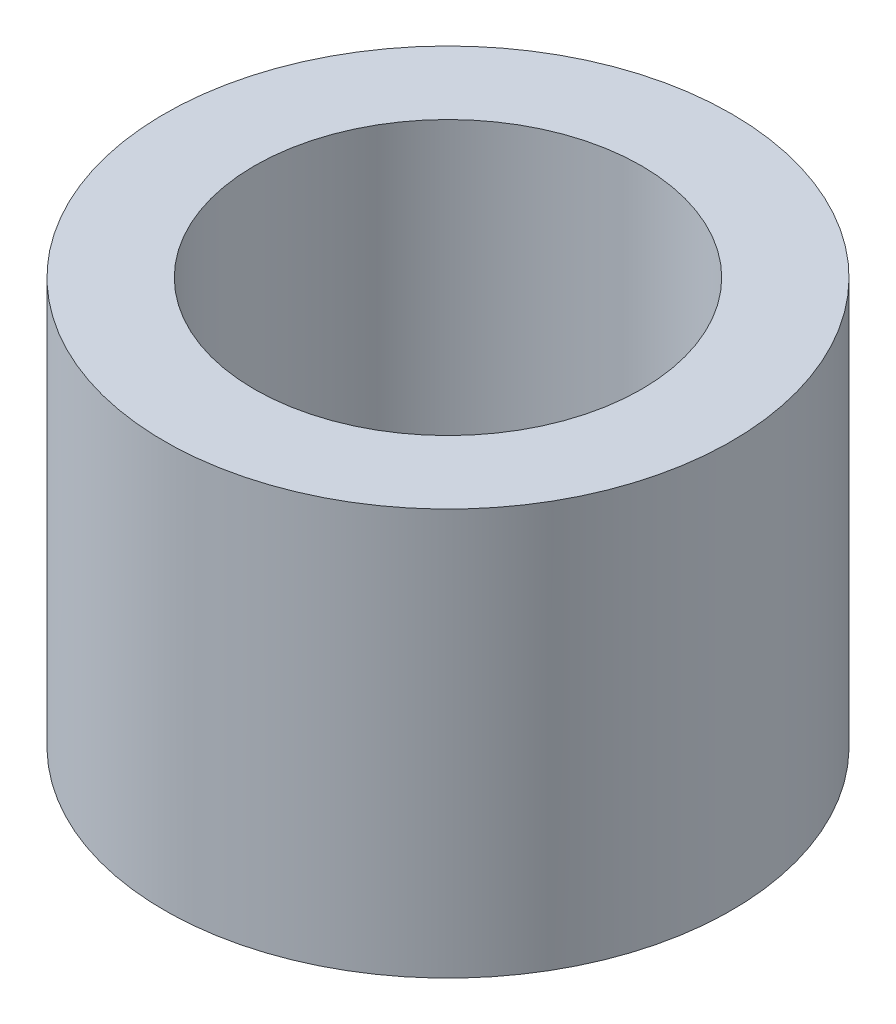
ISO-10303-21;
HEADER;
FILE_DESCRIPTION(('STEP AP214'),'2;1');
FILE_NAME('part.step','',(''),(''),'','','');
FILE_SCHEMA(('AUTOMOTIVE_DESIGN { 1 0 10303 214 1 1 1 1 }'));
ENDSEC;
DATA;
#1=APPLICATION_CONTEXT('core data for automotive mechanical design processes');
#2=APPLICATION_PROTOCOL_DEFINITION('international standard','automotive_design',2000,#1);
#3=PRODUCT_CONTEXT('',#1,'mechanical');
#4=PRODUCT('Part','Part','',(#3));
#5=PRODUCT_RELATED_PRODUCT_CATEGORY('part','',(#4));
#6=PRODUCT_DEFINITION_FORMATION('','',#4);
#7=PRODUCT_DEFINITION_CONTEXT('part definition',#1,'design');
#8=PRODUCT_DEFINITION('design','',#6,#7);
#9=PRODUCT_DEFINITION_SHAPE('','',#8);
#10=(LENGTH_UNIT() NAMED_UNIT(*) SI_UNIT(.MILLI.,.METRE.));
#11=(NAMED_UNIT(*) PLANE_ANGLE_UNIT() SI_UNIT($,.RADIAN.));
#12=(NAMED_UNIT(*) SI_UNIT($,.STERADIAN.) SOLID_ANGLE_UNIT());
#13=UNCERTAINTY_MEASURE_WITH_UNIT(LENGTH_MEASURE(1.E-05),#10,'distance_accuracy_value','');
#14=(GEOMETRIC_REPRESENTATION_CONTEXT(3) GLOBAL_UNCERTAINTY_ASSIGNED_CONTEXT((#13)) GLOBAL_UNIT_ASSIGNED_CONTEXT((#10,
#11,#12)) REPRESENTATION_CONTEXT('',''));
#15=CARTESIAN_POINT('',(0.,0.,0.));
#16=DIRECTION('',(0.,0.,1.));
#17=DIRECTION('',(1.,0.,0.));
#18=AXIS2_PLACEMENT_3D('',#15,#16,#17);
#19=CARTESIAN_POINT('',(0.,11.461,0.));
#20=DIRECTION('',(0.,-1.,0.));
#21=DIRECTION('',(0.,0.,-1.));
#22=AXIS2_PLACEMENT_3D('',#19,#20,#21);
#23=CYLINDRICAL_SURFACE('',#22,8.001);
#24=CARTESIAN_POINT('',(0.,11.461,0.));
#25=DIRECTION('',(0.,1.,0.));
#26=DIRECTION('',(0.,0.,1.));
#27=AXIS2_PLACEMENT_3D('',#24,#25,#26);
#28=CIRCLE('',#27,8.001);
#29=CARTESIAN_POINT('',(0.,11.461,-8.001));
#30=VERTEX_POINT('',#29);
#31=EDGE_CURVE('E11',#30,#30,#28,.T.);
#32=CARTESIAN_POINT('',(0.,0.,0.));
#33=DIRECTION('',(0.,1.,0.));
#34=DIRECTION('',(-1.,0.,0.));
#35=AXIS2_PLACEMENT_3D('',#32,#33,#34);
#36=CIRCLE('',#35,8.001);
#37=CARTESIAN_POINT('',(0.,0.,-8.001));
#38=VERTEX_POINT('',#37);
#39=EDGE_CURVE('E43',#38,#38,#36,.T.);
#40=CARTESIAN_POINT('',(0.,11.461,-8.001));
#41=CARTESIAN_POINT('',(0.,11.3416145833333,-8.001));
#42=CARTESIAN_POINT('',(0.,11.2222291666667,-8.001));
#43=CARTESIAN_POINT('',(0.,10.9834583333333,-8.001));
#44=CARTESIAN_POINT('',(0.,10.8640729166667,-8.001));
#45=CARTESIAN_POINT('',(0.,10.6253020833333,-8.001));
#46=CARTESIAN_POINT('',(0.,10.5059166666667,-8.001));
#47=CARTESIAN_POINT('',(0.,10.2671458333333,-8.001));
#48=CARTESIAN_POINT('',(0.,10.1477604166667,-8.001));
#49=CARTESIAN_POINT('',(0.,9.90898958333334,-8.001));
#50=CARTESIAN_POINT('',(0.,9.78960416666667,-8.001));
#51=CARTESIAN_POINT('',(0.,9.55083333333334,-8.001));
#52=CARTESIAN_POINT('',(0.,9.43144791666667,-8.001));
#53=CARTESIAN_POINT('',(0.,9.19267708333333,-8.001));
#54=CARTESIAN_POINT('',(0.,9.07329166666667,-8.001));
#55=CARTESIAN_POINT('',(0.,8.83452083333333,-8.001));
#56=CARTESIAN_POINT('',(0.,8.71513541666667,-8.001));
#57=CARTESIAN_POINT('',(0.,8.47636458333334,-8.001));
#58=CARTESIAN_POINT('',(0.,8.35697916666667,-8.001));
#59=CARTESIAN_POINT('',(0.,8.11820833333334,-8.001));
#60=CARTESIAN_POINT('',(0.,7.99882291666667,-8.001));
#61=CARTESIAN_POINT('',(0.,7.76005208333334,-8.001));
#62=CARTESIAN_POINT('',(0.,7.64066666666667,-8.001));
#63=CARTESIAN_POINT('',(0.,7.40189583333334,-8.001));
#64=CARTESIAN_POINT('',(0.,7.28251041666667,-8.001));
#65=CARTESIAN_POINT('',(0.,7.04373958333334,-8.001));
#66=CARTESIAN_POINT('',(0.,6.92435416666667,-8.001));
#67=CARTESIAN_POINT('',(0.,6.68558333333334,-8.001));
#68=CARTESIAN_POINT('',(0.,6.56619791666667,-8.001));
#69=CARTESIAN_POINT('',(0.,6.32742708333334,-8.001));
#70=CARTESIAN_POINT('',(0.,6.20804166666667,-8.001));
#71=CARTESIAN_POINT('',(0.,5.96927083333334,-8.001));
#72=CARTESIAN_POINT('',(0.,5.84988541666667,-8.001));
#73=CARTESIAN_POINT('',(0.,5.61111458333334,-8.001));
#74=CARTESIAN_POINT('',(0.,5.49172916666667,-8.001));
#75=CARTESIAN_POINT('',(0.,5.25295833333334,-8.001));
#76=CARTESIAN_POINT('',(0.,5.13357291666667,-8.001));
#77=CARTESIAN_POINT('',(0.,4.89480208333334,-8.001));
#78=CARTESIAN_POINT('',(0.,4.77541666666667,-8.001));
#79=CARTESIAN_POINT('',(0.,4.53664583333334,-8.001));
#80=CARTESIAN_POINT('',(0.,4.41726041666667,-8.001));
#81=CARTESIAN_POINT('',(0.,4.17848958333334,-8.001));
#82=CARTESIAN_POINT('',(0.,4.05910416666667,-8.001));
#83=CARTESIAN_POINT('',(0.,3.82033333333334,-8.001));
#84=CARTESIAN_POINT('',(0.,3.70094791666667,-8.001));
#85=CARTESIAN_POINT('',(0.,3.46217708333334,-8.001));
#86=CARTESIAN_POINT('',(0.,3.34279166666667,-8.001));
#87=CARTESIAN_POINT('',(0.,3.10402083333334,-8.001));
#88=CARTESIAN_POINT('',(0.,2.98463541666667,-8.001));
#89=CARTESIAN_POINT('',(0.,2.74586458333334,-8.001));
#90=CARTESIAN_POINT('',(0.,2.62647916666667,-8.001));
#91=CARTESIAN_POINT('',(0.,2.38770833333334,-8.001));
#92=CARTESIAN_POINT('',(0.,2.26832291666667,-8.001));
#93=CARTESIAN_POINT('',(0.,2.02955208333334,-8.001));
#94=CARTESIAN_POINT('',(0.,1.91016666666667,-8.001));
#95=CARTESIAN_POINT('',(0.,1.67139583333334,-8.001));
#96=CARTESIAN_POINT('',(0.,1.55201041666667,-8.001));
#97=CARTESIAN_POINT('',(0.,1.31323958333334,-8.001));
#98=CARTESIAN_POINT('',(0.,1.19385416666667,-8.001));
#99=CARTESIAN_POINT('',(0.,0.95508333333334,-8.001));
#100=CARTESIAN_POINT('',(0.,0.835697916666673,-8.001));
#101=CARTESIAN_POINT('',(0.,0.59692708333334,-8.001));
#102=CARTESIAN_POINT('',(0.,0.477541666666674,-8.001));
#103=CARTESIAN_POINT('',(0.,0.23877083333334,-8.001));
#104=CARTESIAN_POINT('',(0.,0.119385416666674,-8.001));
#105=CARTESIAN_POINT('',(0.,0.,-8.001));
#106=B_SPLINE_CURVE_WITH_KNOTS('',3,(#40,#41,#42,#43,#44,#45,#46,#47,#48,#49,#50,#51,#52,#53,
#54,#55,#56,#57,#58,#59,#60,#61,#62,#63,#64,#65,#66,#67,#68,#69,#70,#71,#72,#73,#74,#75,#76,#77,
#78,#79,#80,#81,#82,#83,#84,#85,#86,#87,#88,#89,#90,#91,#92,#93,#94,#95,#96,#97,#98,#99,#100,
#101,#102,#103,#104,#105),.UNSPECIFIED.,.F.,.F.,(4,2,2,2,2,2,2,2,2,2,2,2,2,2,2,2,2,2,2,2,2,2,2,
2,2,2,2,2,2,2,2,2,4),(0.,0.358156249999998,0.716312499999998,1.07446875,1.432625,1.79078125,
2.1489375,2.50709375,2.86525,3.22340625,3.5815625,3.93971875,4.297875,4.65603125,
5.01418749999999,5.37234375,5.73049999999999,6.08865625,6.44681249999999,6.80496874999999,
7.16312499999999,7.52128124999999,7.87943749999999,8.23759374999999,8.59574999999999,
8.95390624999999,9.31206249999999,9.67021874999999,10.028375,10.38653125,10.7446875,11.10284375,
11.461),.UNSPECIFIED.);
#107=EDGE_CURVE('BSEAM37',#30,#38,#106,.T.);
#108=ORIENTED_EDGE('',*,*,#31,.F.);
#109=ORIENTED_EDGE('',*,*,#39,.T.);
#110=ORIENTED_EDGE('',*,*,#107,.T.);
#111=ORIENTED_EDGE('',*,*,#107,.F.);
#112=EDGE_LOOP('',(#108,#110,#109,#111));
#113=FACE_BOUND('',#112,.T.);
#114=ADVANCED_FACE('F37',(#113),#23,.T.);
#115=CARTESIAN_POINT('',(0.,11.461,0.));
#116=DIRECTION('',(0.,1.,0.));
#117=DIRECTION('',(0.,0.,1.));
#118=AXIS2_PLACEMENT_3D('',#115,#116,#117);
#119=PLANE('',#118);
#120=CARTESIAN_POINT('',(0.,11.461,0.));
#121=DIRECTION('',(0.,1.,0.));
#122=DIRECTION('',(0.,0.,1.));
#123=AXIS2_PLACEMENT_3D('',#120,#121,#122);
#124=CIRCLE('',#123,5.461);
#125=CARTESIAN_POINT('',(0.,11.461,5.461));
#126=VERTEX_POINT('',#125);
#127=EDGE_CURVE('E70',#126,#126,#124,.T.);
#128=ORIENTED_EDGE('',*,*,#127,.F.);
#129=EDGE_LOOP('',(#128));
#130=FACE_BOUND('',#129,.T.);
#131=ORIENTED_EDGE('',*,*,#31,.T.);
#132=EDGE_LOOP('',(#131));
#133=FACE_BOUND('',#132,.T.);
#134=ADVANCED_FACE('F49',(#130,#133),#119,.T.);
#135=CARTESIAN_POINT('',(0.,-2.54,0.));
#136=DIRECTION('',(0.,1.,0.));
#137=DIRECTION('',(-1.,0.,0.));
#138=AXIS2_PLACEMENT_3D('',#135,#136,#137);
#139=CONICAL_SURFACE('',#138,0.,1.26339885367207);
#140=ORIENTED_EDGE('',*,*,#39,.F.);
#141=EDGE_LOOP('',(#140));
#142=FACE_BOUND('',#141,.T.);
#143=CARTESIAN_POINT('',(0.,-2.54,0.));
#144=VERTEX_POINT('',#143);
#145=VERTEX_LOOP('',#144);
#146=FACE_BOUND('',#145,.T.);
#147=ADVANCED_FACE('F46',(#142,#146),#139,.T.);
#148=CARTESIAN_POINT('',(0.,2.001,0.));
#149=DIRECTION('',(0.,1.,0.));
#150=DIRECTION('',(0.,0.,1.));
#151=AXIS2_PLACEMENT_3D('',#148,#149,#150);
#152=CYLINDRICAL_SURFACE('',#151,5.461);
#153=CARTESIAN_POINT('',(0.,2.001,0.));
#154=DIRECTION('',(0.,1.,0.));
#155=DIRECTION('',(0.,0.,1.));
#156=AXIS2_PLACEMENT_3D('',#153,#154,#155);
#157=CIRCLE('',#156,5.461);
#158=CARTESIAN_POINT('',(0.,2.001,5.461));
#159=VERTEX_POINT('',#158);
#160=EDGE_CURVE('E68',#159,#159,#157,.T.);
#161=CARTESIAN_POINT('',(0.,2.001,5.461));
#162=CARTESIAN_POINT('',(0.,2.09954166666667,5.461));
#163=CARTESIAN_POINT('',(0.,2.19808333333333,5.461));
#164=CARTESIAN_POINT('',(0.,2.39516666666667,5.461));
#165=CARTESIAN_POINT('',(0.,2.49370833333333,5.461));
#166=CARTESIAN_POINT('',(0.,2.69079166666667,5.461));
#167=CARTESIAN_POINT('',(0.,2.78933333333333,5.461));
#168=CARTESIAN_POINT('',(0.,2.98641666666667,5.461));
#169=CARTESIAN_POINT('',(0.,3.08495833333333,5.461));
#170=CARTESIAN_POINT('',(0.,3.28204166666667,5.461));
#171=CARTESIAN_POINT('',(0.,3.38058333333333,5.461));
#172=CARTESIAN_POINT('',(0.,3.57766666666667,5.461));
#173=CARTESIAN_POINT('',(0.,3.67620833333333,5.461));
#174=CARTESIAN_POINT('',(0.,3.87329166666667,5.461));
#175=CARTESIAN_POINT('',(0.,3.97183333333333,5.461));
#176=CARTESIAN_POINT('',(0.,4.16891666666667,5.461));
#177=CARTESIAN_POINT('',(0.,4.26745833333333,5.461));
#178=CARTESIAN_POINT('',(0.,4.46454166666667,5.461));
#179=CARTESIAN_POINT('',(0.,4.56308333333333,5.461));
#180=CARTESIAN_POINT('',(0.,4.76016666666667,5.461));
#181=CARTESIAN_POINT('',(0.,4.85870833333333,5.461));
#182=CARTESIAN_POINT('',(0.,5.05579166666667,5.461));
#183=CARTESIAN_POINT('',(0.,5.15433333333333,5.461));
#184=CARTESIAN_POINT('',(0.,5.35141666666667,5.461));
#185=CARTESIAN_POINT('',(0.,5.44995833333333,5.461));
#186=CARTESIAN_POINT('',(0.,5.64704166666667,5.461));
#187=CARTESIAN_POINT('',(0.,5.74558333333333,5.461));
#188=CARTESIAN_POINT('',(0.,5.94266666666667,5.461));
#189=CARTESIAN_POINT('',(0.,6.04120833333333,5.461));
#190=CARTESIAN_POINT('',(0.,6.23829166666667,5.461));
#191=CARTESIAN_POINT('',(0.,6.33683333333333,5.461));
#192=CARTESIAN_POINT('',(0.,6.53391666666667,5.461));
#193=CARTESIAN_POINT('',(0.,6.63245833333333,5.461));
#194=CARTESIAN_POINT('',(0.,6.82954166666667,5.461));
#195=CARTESIAN_POINT('',(0.,6.92808333333333,5.461));
#196=CARTESIAN_POINT('',(0.,7.12516666666667,5.461));
#197=CARTESIAN_POINT('',(0.,7.22370833333333,5.461));
#198=CARTESIAN_POINT('',(0.,7.42079166666667,5.461));
#199=CARTESIAN_POINT('',(0.,7.51933333333333,5.461));
#200=CARTESIAN_POINT('',(0.,7.71641666666667,5.461));
#201=CARTESIAN_POINT('',(0.,7.81495833333333,5.461));
#202=CARTESIAN_POINT('',(0.,8.01204166666667,5.461));
#203=CARTESIAN_POINT('',(0.,8.11058333333333,5.461));
#204=CARTESIAN_POINT('',(0.,8.30766666666667,5.461));
#205=CARTESIAN_POINT('',(0.,8.40620833333334,5.461));
#206=CARTESIAN_POINT('',(0.,8.60329166666667,5.461));
#207=CARTESIAN_POINT('',(0.,8.70183333333333,5.461));
#208=CARTESIAN_POINT('',(0.,8.89891666666667,5.461));
#209=CARTESIAN_POINT('',(0.,8.99745833333333,5.461));
#210=CARTESIAN_POINT('',(0.,9.19454166666667,5.461));
#211=CARTESIAN_POINT('',(0.,9.29308333333333,5.461));
#212=CARTESIAN_POINT('',(0.,9.49016666666667,5.461));
#213=CARTESIAN_POINT('',(0.,9.58870833333333,5.461));
#214=CARTESIAN_POINT('',(0.,9.78579166666667,5.461));
#215=CARTESIAN_POINT('',(0.,9.88433333333333,5.461));
#216=CARTESIAN_POINT('',(0.,10.0814166666667,5.461));
#217=CARTESIAN_POINT('',(0.,10.1799583333333,5.461));
#218=CARTESIAN_POINT('',(0.,10.3770416666667,5.461));
#219=CARTESIAN_POINT('',(0.,10.4755833333333,5.461));
#220=CARTESIAN_POINT('',(0.,10.6726666666667,5.461));
#221=CARTESIAN_POINT('',(0.,10.7712083333333,5.461));
#222=CARTESIAN_POINT('',(0.,10.9682916666667,5.461));
#223=CARTESIAN_POINT('',(0.,11.0668333333333,5.461));
#224=CARTESIAN_POINT('',(0.,11.2639166666667,5.461));
#225=CARTESIAN_POINT('',(0.,11.3624583333333,5.461));
#226=CARTESIAN_POINT('',(0.,11.461,5.461));
#227=B_SPLINE_CURVE_WITH_KNOTS('',3,(#161,#162,#163,#164,#165,#166,#167,#168,#169,#170,#171,
#172,#173,#174,#175,#176,#177,#178,#179,#180,#181,#182,#183,#184,#185,#186,#187,#188,#189,#190,
#191,#192,#193,#194,#195,#196,#197,#198,#199,#200,#201,#202,#203,#204,#205,#206,#207,#208,#209,
#210,#211,#212,#213,#214,#215,#216,#217,#218,#219,#220,#221,#222,#223,#224,#225,#226),
.UNSPECIFIED.,.F.,.F.,(4,2,2,2,2,2,2,2,2,2,2,2,2,2,2,2,2,2,2,2,2,2,2,2,2,2,2,2,2,2,2,2,4),(0.,
0.295625,0.59125,0.886875,1.1825,1.478125,1.77375,2.069375,2.365,2.660625,2.95625,3.251875,
3.5475,3.843125,4.13875,4.434375,4.73,5.025625,5.32125,5.616875,5.9125,6.208125,6.50375,
6.799375,7.095,7.390625,7.68625,7.981875,8.2775,8.573125,8.86875,9.164375,9.46),.UNSPECIFIED.);
#228=EDGE_CURVE('BSEAM48',#159,#126,#227,.T.);
#229=ORIENTED_EDGE('',*,*,#160,.F.);
#230=ORIENTED_EDGE('',*,*,#127,.T.);
#231=ORIENTED_EDGE('',*,*,#228,.T.);
#232=ORIENTED_EDGE('',*,*,#228,.F.);
#233=EDGE_LOOP('',(#229,#231,#230,#232));
#234=FACE_BOUND('',#233,.T.);
#235=ADVANCED_FACE('F48',(#234),#152,.F.);
#236=CARTESIAN_POINT('',(0.,2.001,0.));
#237=DIRECTION('',(0.,1.,0.));
#238=DIRECTION('',(0.,0.,1.));
#239=AXIS2_PLACEMENT_3D('',#236,#237,#238);
#240=PLANE('',#239);
#241=ORIENTED_EDGE('',*,*,#160,.T.);
#242=EDGE_LOOP('',(#241));
#243=FACE_BOUND('',#242,.T.);
#244=ADVANCED_FACE('F56',(#243),#240,.T.);
#245=CLOSED_SHELL('',(#114,#134,#147,#235,#244));
#246=MANIFOLD_SOLID_BREP('B2',#245);
#247=ADVANCED_BREP_SHAPE_REPRESENTATION('',(#18,#246),#14);
#248=SHAPE_DEFINITION_REPRESENTATION(#9,#247);
ENDSEC;
END-ISO-10303-21;
